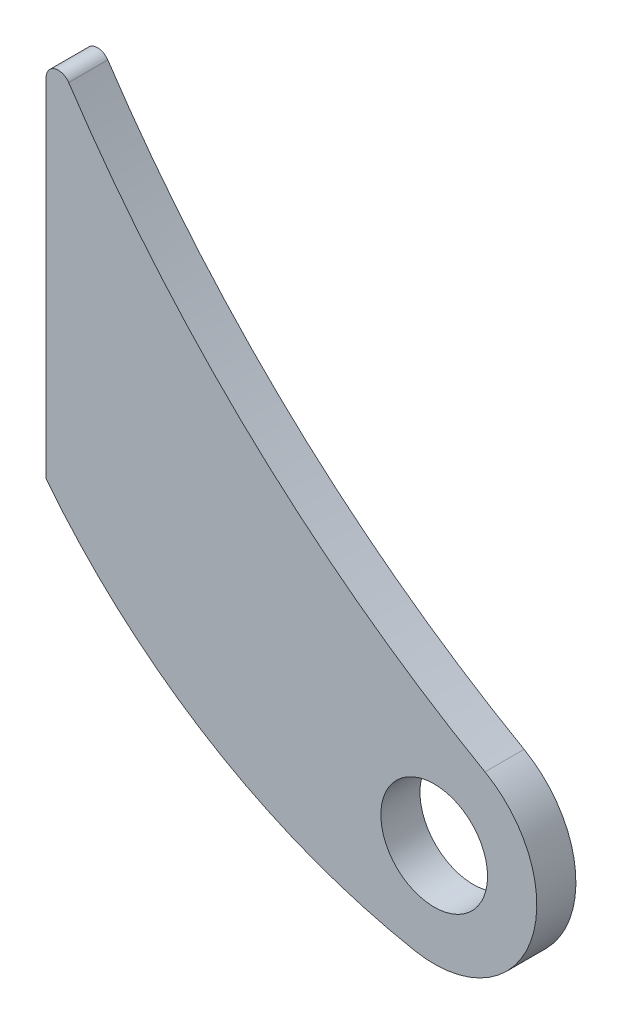
ISO-10303-21;
HEADER;
FILE_DESCRIPTION(('STEP AP214'),'2;1');
FILE_NAME('part.step','',(''),(''),'','','');
FILE_SCHEMA(('AUTOMOTIVE_DESIGN { 1 0 10303 214 1 1 1 1 }'));
ENDSEC;
DATA;
#1=APPLICATION_CONTEXT('core data for automotive mechanical design processes');
#2=APPLICATION_PROTOCOL_DEFINITION('international standard','automotive_design',2000,#1);
#3=PRODUCT_CONTEXT('',#1,'mechanical');
#4=PRODUCT('Part','Part','',(#3));
#5=PRODUCT_RELATED_PRODUCT_CATEGORY('part','',(#4));
#6=PRODUCT_DEFINITION_FORMATION('','',#4);
#7=PRODUCT_DEFINITION_CONTEXT('part definition',#1,'design');
#8=PRODUCT_DEFINITION('design','',#6,#7);
#9=PRODUCT_DEFINITION_SHAPE('','',#8);
#10=(LENGTH_UNIT() NAMED_UNIT(*) SI_UNIT(.MILLI.,.METRE.));
#11=(NAMED_UNIT(*) PLANE_ANGLE_UNIT() SI_UNIT($,.RADIAN.));
#12=(NAMED_UNIT(*) SI_UNIT($,.STERADIAN.) SOLID_ANGLE_UNIT());
#13=UNCERTAINTY_MEASURE_WITH_UNIT(LENGTH_MEASURE(1.E-05),#10,'distance_accuracy_value','');
#14=(GEOMETRIC_REPRESENTATION_CONTEXT(3) GLOBAL_UNCERTAINTY_ASSIGNED_CONTEXT((#13)) GLOBAL_UNIT_ASSIGNED_CONTEXT((#10,
#11,#12)) REPRESENTATION_CONTEXT('',''));
#15=CARTESIAN_POINT('',(0.,0.,0.));
#16=DIRECTION('',(0.,0.,1.));
#17=DIRECTION('',(1.,0.,0.));
#18=AXIS2_PLACEMENT_3D('',#15,#16,#17);
#19=CARTESIAN_POINT('',(210.896548306015,227.37793954771,4.765));
#20=DIRECTION('',(0.,0.,1.));
#21=DIRECTION('',(1.,0.,0.));
#22=AXIS2_PLACEMENT_3D('',#19,#20,#21);
#23=PLANE('',#22);
#24=CARTESIAN_POINT('',(210.896548306015,227.37793954771,4.765));
#25=DIRECTION('',(0.,0.,-1.));
#26=DIRECTION('',(1.,0.,0.));
#27=AXIS2_PLACEMENT_3D('',#24,#25,#26);
#28=CIRCLE('',#27,300.);
#29=CARTESIAN_POINT('',(62.3766575620011,-33.2786200347915,4.765));
#30=VERTEX_POINT('',#29);
#31=CARTESIAN_POINT('',(-39.053111105881,61.4708337328074,4.765));
#32=VERTEX_POINT('',#31);
#33=EDGE_CURVE('E91',#30,#32,#28,.T.);
#34=ORIENTED_EDGE('',*,*,#33,.T.);
#35=CARTESIAN_POINT('',(-41.5526077,59.8117626746584,4.765));
#36=DIRECTION('',(0.,0.,1.));
#37=DIRECTION('',(1.,0.,0.));
#38=AXIS2_PLACEMENT_3D('',#35,#36,#37);
#39=CIRCLE('',#38,3.);
#40=CARTESIAN_POINT('',(-44.5526077,59.8117626746584,4.765));
#41=VERTEX_POINT('',#40);
#42=EDGE_CURVE('E11',#32,#41,#39,.T.);
#43=ORIENTED_EDGE('',*,*,#42,.T.);
#44=DIRECTION('',(0.,-1.,0.));
#45=VECTOR('',#44,1.);
#46=CARTESIAN_POINT('',(-44.5526077,70.0701880037549,4.765));
#47=LINE('',#46,#45);
#48=CARTESIAN_POINT('',(-44.5526077,-24.9298119962451,4.765));
#49=VERTEX_POINT('',#48);
#50=EDGE_CURVE('E81',#41,#49,#47,.T.);
#51=ORIENTED_EDGE('',*,*,#50,.T.);
#52=CARTESIAN_POINT('',(73.3510185459765,67.799551843097,4.765));
#53=DIRECTION('',(0.,0.,1.));
#54=DIRECTION('',(1.,0.,0.));
#55=AXIS2_PLACEMENT_3D('',#52,#53,#54);
#56=CIRCLE('',#55,150.);
#57=CARTESIAN_POINT('',(45.3297962908047,-79.5599103686194,4.765));
#58=VERTEX_POINT('',#57);
#59=EDGE_CURVE('E85',#49,#58,#56,.T.);
#60=ORIENTED_EDGE('',*,*,#59,.T.);
#61=CARTESIAN_POINT('',(50.,-55.,4.765));
#62=DIRECTION('',(0.,0.,1.));
#63=DIRECTION('',(1.,0.,0.));
#64=AXIS2_PLACEMENT_3D('',#61,#62,#63);
#65=CIRCLE('',#64,25.);
#66=EDGE_CURVE('E105',#58,#30,#65,.T.);
#67=ORIENTED_EDGE('',*,*,#66,.T.);
#68=EDGE_LOOP('',(#34,#43,#51,#60,#67));
#69=FACE_BOUND('',#68,.T.);
#70=CARTESIAN_POINT('',(50.,-55.,4.765));
#71=DIRECTION('',(0.,0.,1.));
#72=DIRECTION('',(1.,0.,0.));
#73=AXIS2_PLACEMENT_3D('',#70,#71,#72);
#74=CIRCLE('',#73,13.);
#75=CARTESIAN_POINT('',(63.,-55.,4.765));
#76=VERTEX_POINT('',#75);
#77=EDGE_CURVE('E113',#76,#76,#74,.T.);
#78=ORIENTED_EDGE('',*,*,#77,.F.);
#79=EDGE_LOOP('',(#78));
#80=FACE_BOUND('',#79,.T.);
#81=ADVANCED_FACE('F35',(#69,#80),#23,.T.);
#82=CARTESIAN_POINT('',(210.896548306015,227.37793954771,-4.765));
#83=DIRECTION('',(0.,0.,1.));
#84=DIRECTION('',(1.,0.,0.));
#85=AXIS2_PLACEMENT_3D('',#82,#83,#84);
#86=PLANE('',#85);
#87=DIRECTION('',(0.,-1.,0.));
#88=VECTOR('',#87,1.);
#89=CARTESIAN_POINT('',(-44.5526077,70.0701880037549,-4.765));
#90=LINE('',#89,#88);
#91=CARTESIAN_POINT('',(-44.5526077,59.8117626746584,-4.765));
#92=VERTEX_POINT('',#91);
#93=CARTESIAN_POINT('',(-44.5526077,-24.9298119962451,-4.765));
#94=VERTEX_POINT('',#93);
#95=EDGE_CURVE('E96',#92,#94,#90,.T.);
#96=ORIENTED_EDGE('',*,*,#95,.F.);
#97=CARTESIAN_POINT('',(-41.5526077,59.8117626746584,-4.765));
#98=DIRECTION('',(0.,0.,1.));
#99=DIRECTION('',(1.,0.,0.));
#100=AXIS2_PLACEMENT_3D('',#97,#98,#99);
#101=CIRCLE('',#100,3.);
#102=CARTESIAN_POINT('',(-39.053111105881,61.4708337328074,-4.765));
#103=VERTEX_POINT('',#102);
#104=EDGE_CURVE('E57',#92,#103,#101,.F.);
#105=ORIENTED_EDGE('',*,*,#104,.T.);
#106=CARTESIAN_POINT('',(210.896548306015,227.37793954771,-4.765));
#107=DIRECTION('',(0.,0.,-1.));
#108=DIRECTION('',(1.,0.,0.));
#109=AXIS2_PLACEMENT_3D('',#106,#107,#108);
#110=CIRCLE('',#109,300.);
#111=CARTESIAN_POINT('',(62.3766575620011,-33.2786200347915,-4.765));
#112=VERTEX_POINT('',#111);
#113=EDGE_CURVE('E111',#112,#103,#110,.T.);
#114=ORIENTED_EDGE('',*,*,#113,.F.);
#115=CARTESIAN_POINT('',(50.,-55.,-4.765));
#116=DIRECTION('',(0.,0.,1.));
#117=DIRECTION('',(1.,0.,0.));
#118=AXIS2_PLACEMENT_3D('',#115,#116,#117);
#119=CIRCLE('',#118,25.);
#120=CARTESIAN_POINT('',(45.3297962908047,-79.5599103686194,-4.765));
#121=VERTEX_POINT('',#120);
#122=EDGE_CURVE('E117',#121,#112,#119,.T.);
#123=ORIENTED_EDGE('',*,*,#122,.F.);
#124=CARTESIAN_POINT('',(73.3510185459765,67.799551843097,-4.765));
#125=DIRECTION('',(0.,0.,1.));
#126=DIRECTION('',(1.,0.,0.));
#127=AXIS2_PLACEMENT_3D('',#124,#125,#126);
#128=CIRCLE('',#127,150.);
#129=EDGE_CURVE('E115',#94,#121,#128,.T.);
#130=ORIENTED_EDGE('',*,*,#129,.F.);
#131=EDGE_LOOP('',(#96,#105,#114,#123,#130));
#132=FACE_BOUND('',#131,.T.);
#133=CARTESIAN_POINT('',(50.,-55.,-4.765));
#134=DIRECTION('',(0.,0.,1.));
#135=DIRECTION('',(1.,0.,0.));
#136=AXIS2_PLACEMENT_3D('',#133,#134,#135);
#137=CIRCLE('',#136,13.);
#138=CARTESIAN_POINT('',(63.,-55.,-4.765));
#139=VERTEX_POINT('',#138);
#140=EDGE_CURVE('E200',#139,#139,#137,.T.);
#141=ORIENTED_EDGE('',*,*,#140,.T.);
#142=EDGE_LOOP('',(#141));
#143=FACE_BOUND('',#142,.T.);
#144=ADVANCED_FACE('F124',(#132,#143),#86,.F.);
#145=CARTESIAN_POINT('',(210.896548306015,227.37793954771,4.765));
#146=DIRECTION('',(0.,0.,-1.));
#147=DIRECTION('',(-1.,0.,0.));
#148=AXIS2_PLACEMENT_3D('',#145,#146,#147);
#149=CYLINDRICAL_SURFACE('',#148,300.);
#150=ORIENTED_EDGE('',*,*,#113,.T.);
#151=DIRECTION('',(0.,0.,-1.));
#152=VECTOR('',#151,1.);
#153=CARTESIAN_POINT('',(-39.053111105881,61.4708337328074,4.765));
#154=LINE('',#153,#152);
#155=EDGE_CURVE('E43',#103,#32,#154,.F.);
#156=ORIENTED_EDGE('',*,*,#155,.T.);
#157=ORIENTED_EDGE('',*,*,#33,.F.);
#158=DIRECTION('',(0.,0.,-1.));
#159=VECTOR('',#158,1.);
#160=CARTESIAN_POINT('',(62.3766575620011,-33.2786200347915,4.765));
#161=LINE('',#160,#159);
#162=EDGE_CURVE('E107',#30,#112,#161,.T.);
#163=ORIENTED_EDGE('',*,*,#162,.T.);
#164=EDGE_LOOP('',(#150,#156,#157,#163));
#165=FACE_BOUND('',#164,.T.);
#166=ADVANCED_FACE('F142',(#165),#149,.F.);
#167=CARTESIAN_POINT('',(-44.5526077,70.0701880037549,4.765));
#168=DIRECTION('',(1.,0.,0.));
#169=DIRECTION('',(0.,1.,0.));
#170=AXIS2_PLACEMENT_3D('',#167,#168,#169);
#171=PLANE('',#170);
#172=ORIENTED_EDGE('',*,*,#50,.F.);
#173=DIRECTION('',(0.,0.,-1.));
#174=VECTOR('',#173,1.);
#175=CARTESIAN_POINT('',(-44.5526077,59.8117626746584,4.765));
#176=LINE('',#175,#174);
#177=EDGE_CURVE('E99',#41,#92,#176,.T.);
#178=ORIENTED_EDGE('',*,*,#177,.T.);
#179=ORIENTED_EDGE('',*,*,#95,.T.);
#180=DIRECTION('',(0.,0.,-1.));
#181=VECTOR('',#180,1.);
#182=CARTESIAN_POINT('',(-44.5526077,-24.9298119962451,4.765));
#183=LINE('',#182,#181);
#184=EDGE_CURVE('E94',#49,#94,#183,.T.);
#185=ORIENTED_EDGE('',*,*,#184,.F.);
#186=EDGE_LOOP('',(#172,#178,#179,#185));
#187=FACE_BOUND('',#186,.T.);
#188=ADVANCED_FACE('F95',(#187),#171,.F.);
#189=CARTESIAN_POINT('',(73.3510185459765,67.799551843097,4.765));
#190=DIRECTION('',(0.,0.,-1.));
#191=DIRECTION('',(-1.,0.,0.));
#192=AXIS2_PLACEMENT_3D('',#189,#190,#191);
#193=CYLINDRICAL_SURFACE('',#192,150.);
#194=ORIENTED_EDGE('',*,*,#129,.T.);
#195=DIRECTION('',(0.,0.,-1.));
#196=VECTOR('',#195,1.);
#197=CARTESIAN_POINT('',(45.3297962908047,-79.5599103686194,4.765));
#198=LINE('',#197,#196);
#199=EDGE_CURVE('E100',#58,#121,#198,.T.);
#200=ORIENTED_EDGE('',*,*,#199,.F.);
#201=ORIENTED_EDGE('',*,*,#59,.F.);
#202=ORIENTED_EDGE('',*,*,#184,.T.);
#203=EDGE_LOOP('',(#194,#200,#201,#202));
#204=FACE_BOUND('',#203,.T.);
#205=ADVANCED_FACE('F102',(#204),#193,.T.);
#206=CARTESIAN_POINT('',(50.,-55.,4.765));
#207=DIRECTION('',(0.,0.,-1.));
#208=DIRECTION('',(-1.,0.,0.));
#209=AXIS2_PLACEMENT_3D('',#206,#207,#208);
#210=CYLINDRICAL_SURFACE('',#209,25.);
#211=ORIENTED_EDGE('',*,*,#122,.T.);
#212=ORIENTED_EDGE('',*,*,#162,.F.);
#213=ORIENTED_EDGE('',*,*,#66,.F.);
#214=ORIENTED_EDGE('',*,*,#199,.T.);
#215=EDGE_LOOP('',(#211,#212,#213,#214));
#216=FACE_BOUND('',#215,.T.);
#217=ADVANCED_FACE('F128',(#216),#210,.T.);
#218=CARTESIAN_POINT('',(50.,-55.,4.765));
#219=DIRECTION('',(0.,0.,-1.));
#220=DIRECTION('',(-1.,0.,0.));
#221=AXIS2_PLACEMENT_3D('',#218,#219,#220);
#222=CYLINDRICAL_SURFACE('',#221,13.);
#223=ORIENTED_EDGE('',*,*,#77,.T.);
#224=EDGE_LOOP('',(#223));
#225=FACE_BOUND('',#224,.T.);
#226=ORIENTED_EDGE('',*,*,#140,.F.);
#227=EDGE_LOOP('',(#226));
#228=FACE_BOUND('',#227,.T.);
#229=ADVANCED_FACE('F131',(#225,#228),#222,.F.);
#230=CARTESIAN_POINT('',(-41.5526077,59.8117626746584,4.765));
#231=DIRECTION('',(0.,0.,-1.));
#232=DIRECTION('',(-1.,0.,0.));
#233=AXIS2_PLACEMENT_3D('',#230,#231,#232);
#234=CYLINDRICAL_SURFACE('',#233,3.);
#235=ORIENTED_EDGE('',*,*,#42,.F.);
#236=ORIENTED_EDGE('',*,*,#155,.F.);
#237=ORIENTED_EDGE('',*,*,#104,.F.);
#238=ORIENTED_EDGE('',*,*,#177,.F.);
#239=EDGE_LOOP('',(#235,#236,#237,#238));
#240=FACE_BOUND('',#239,.T.);
#241=ADVANCED_FACE('F37',(#240),#234,.T.);
#242=CLOSED_SHELL('',(#81,#144,#166,#188,#205,#217,#229,#241));
#243=MANIFOLD_SOLID_BREP('B2',#242);
#244=ADVANCED_BREP_SHAPE_REPRESENTATION('',(#18,#243),#14);
#245=SHAPE_DEFINITION_REPRESENTATION(#9,#244);
ENDSEC;
END-ISO-10303-21;
